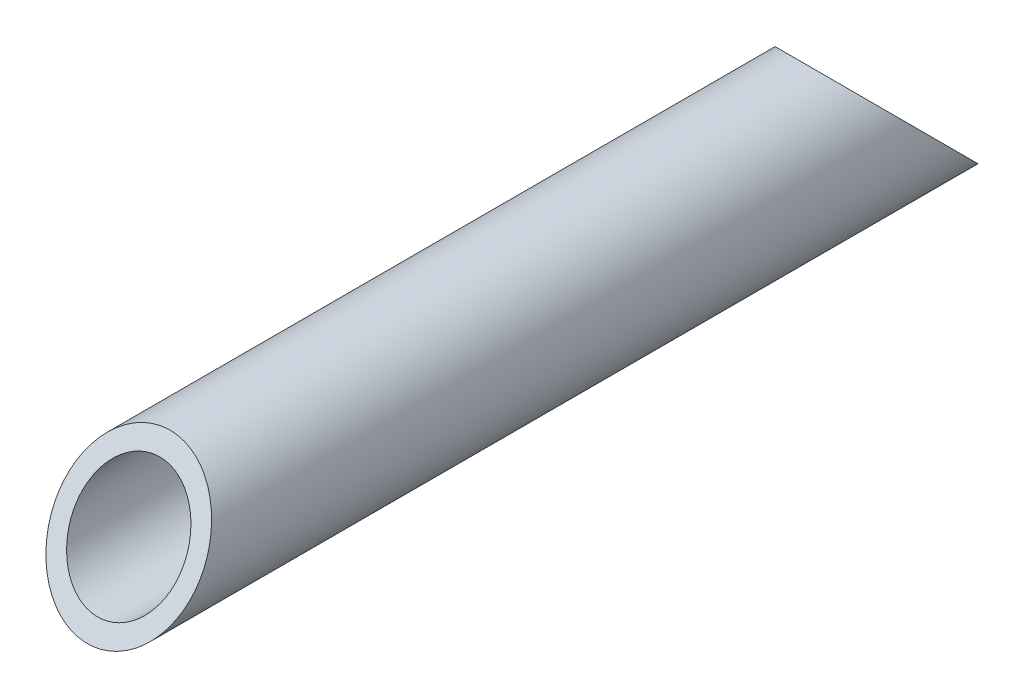
ISO-10303-21;
HEADER;
FILE_DESCRIPTION(('STEP AP214'),'2;1');
FILE_NAME('part.step','',(''),(''),'','','');
FILE_SCHEMA(('AUTOMOTIVE_DESIGN { 1 0 10303 214 1 1 1 1 }'));
ENDSEC;
DATA;
#1=APPLICATION_CONTEXT('core data for automotive mechanical design processes');
#2=APPLICATION_PROTOCOL_DEFINITION('international standard','automotive_design',2000,#1);
#3=PRODUCT_CONTEXT('',#1,'mechanical');
#4=PRODUCT('Part','Part','',(#3));
#5=PRODUCT_RELATED_PRODUCT_CATEGORY('part','',(#4));
#6=PRODUCT_DEFINITION_FORMATION('','',#4);
#7=PRODUCT_DEFINITION_CONTEXT('part definition',#1,'design');
#8=PRODUCT_DEFINITION('design','',#6,#7);
#9=PRODUCT_DEFINITION_SHAPE('','',#8);
#10=(LENGTH_UNIT() NAMED_UNIT(*) SI_UNIT(.MILLI.,.METRE.));
#11=(NAMED_UNIT(*) PLANE_ANGLE_UNIT() SI_UNIT($,.RADIAN.));
#12=(NAMED_UNIT(*) SI_UNIT($,.STERADIAN.) SOLID_ANGLE_UNIT());
#13=UNCERTAINTY_MEASURE_WITH_UNIT(LENGTH_MEASURE(1.E-05),#10,'distance_accuracy_value','');
#14=(GEOMETRIC_REPRESENTATION_CONTEXT(3) GLOBAL_UNCERTAINTY_ASSIGNED_CONTEXT((#13)) GLOBAL_UNIT_ASSIGNED_CONTEXT((#10,
#11,#12)) REPRESENTATION_CONTEXT('',''));
#15=CARTESIAN_POINT('',(0.,0.,0.));
#16=DIRECTION('',(0.,0.,1.));
#17=DIRECTION('',(1.,0.,0.));
#18=AXIS2_PLACEMENT_3D('',#15,#16,#17);
#19=CARTESIAN_POINT('',(0.,0.,76.2));
#20=DIRECTION('',(0.,0.,-1.));
#21=DIRECTION('',(-1.,0.,0.));
#22=AXIS2_PLACEMENT_3D('',#19,#20,#21);
#23=CYLINDRICAL_SURFACE('',#22,6.35);
#24=CARTESIAN_POINT('',(0.,0.,72.5338257906458));
#25=DIRECTION('',(0.,-0.500000000000004,-0.866025403784436));
#26=DIRECTION('',(0.,0.866025403784436,-0.500000000000004));
#27=AXIS2_PLACEMENT_3D('',#24,#25,#26);
#28=ELLIPSE('',#27,7.33234841870827,6.35);
#29=CARTESIAN_POINT('',(0.,6.35,68.8676515812917));
#30=VERTEX_POINT('',#29);
#31=EDGE_CURVE('E10',#30,#30,#28,.T.);
#32=ORIENTED_EDGE('',*,*,#31,.T.);
#33=EDGE_LOOP('',(#32));
#34=FACE_BOUND('',#33,.T.);
#35=CARTESIAN_POINT('',(0.,0.,6.35000000000013));
#36=DIRECTION('',(0.,-0.707106781186552,0.707106781186544));
#37=DIRECTION('',(0.,-0.707106781186544,-0.707106781186552));
#38=AXIS2_PLACEMENT_3D('',#35,#36,#37);
#39=ELLIPSE('',#38,8.9802561210692,6.35);
#40=CARTESIAN_POINT('',(0.,-6.35,0.));
#41=VERTEX_POINT('',#40);
#42=EDGE_CURVE('E42',#41,#41,#39,.T.);
#43=ORIENTED_EDGE('',*,*,#42,.T.);
#44=EDGE_LOOP('',(#43));
#45=FACE_BOUND('',#44,.T.);
#46=ADVANCED_FACE('F30',(#34,#45),#23,.T.);
#47=CARTESIAN_POINT('',(0.,0.,76.2));
#48=DIRECTION('',(0.,0.,-1.));
#49=DIRECTION('',(-1.,0.,0.));
#50=AXIS2_PLACEMENT_3D('',#47,#48,#49);
#51=CYLINDRICAL_SURFACE('',#50,4.7625);
#52=CARTESIAN_POINT('',(0.,0.,6.35000000000013));
#53=DIRECTION('',(0.,-0.707106781186552,0.707106781186544));
#54=DIRECTION('',(0.,-0.707106781186544,-0.707106781186552));
#55=AXIS2_PLACEMENT_3D('',#52,#53,#54);
#56=ELLIPSE('',#55,6.7351920908019,4.7625);
#57=CARTESIAN_POINT('',(0.,-4.7625,1.58750000000008));
#58=VERTEX_POINT('',#57);
#59=EDGE_CURVE('E33',#58,#58,#56,.T.);
#60=ORIENTED_EDGE('',*,*,#59,.F.);
#61=EDGE_LOOP('',(#60));
#62=FACE_BOUND('',#61,.T.);
#63=CARTESIAN_POINT('',(0.,0.,72.5338257906458));
#64=DIRECTION('',(0.,-0.500000000000004,-0.866025403784436));
#65=DIRECTION('',(0.,0.866025403784436,-0.500000000000004));
#66=AXIS2_PLACEMENT_3D('',#63,#64,#65);
#67=ELLIPSE('',#66,5.4992613140312,4.7625);
#68=CARTESIAN_POINT('',(0.,4.7625,69.7841951336302));
#69=VERTEX_POINT('',#68);
#70=EDGE_CURVE('E37',#69,#69,#67,.T.);
#71=ORIENTED_EDGE('',*,*,#70,.F.);
#72=EDGE_LOOP('',(#71));
#73=FACE_BOUND('',#72,.T.);
#74=ADVANCED_FACE('F53',(#62,#73),#51,.F.);
#75=CARTESIAN_POINT('',(-38.1,-6.35,76.2));
#76=DIRECTION('',(0.,-0.500000000000004,-0.866025403784436));
#77=DIRECTION('',(0.,0.866025403784436,-0.500000000000004));
#78=AXIS2_PLACEMENT_3D('',#75,#76,#77);
#79=PLANE('',#78);
#80=ORIENTED_EDGE('',*,*,#70,.T.);
#81=EDGE_LOOP('',(#80));
#82=FACE_BOUND('',#81,.T.);
#83=ORIENTED_EDGE('',*,*,#31,.F.);
#84=EDGE_LOOP('',(#83));
#85=FACE_BOUND('',#84,.T.);
#86=ADVANCED_FACE('F56',(#82,#85),#79,.F.);
#87=CARTESIAN_POINT('',(-38.1,6.35,12.7000000000002));
#88=DIRECTION('',(0.,-0.707106781186552,0.707106781186544));
#89=DIRECTION('',(0.,-0.707106781186544,-0.707106781186552));
#90=AXIS2_PLACEMENT_3D('',#87,#88,#89);
#91=PLANE('',#90);
#92=ORIENTED_EDGE('',*,*,#59,.T.);
#93=EDGE_LOOP('',(#92));
#94=FACE_BOUND('',#93,.T.);
#95=ORIENTED_EDGE('',*,*,#42,.F.);
#96=EDGE_LOOP('',(#95));
#97=FACE_BOUND('',#96,.T.);
#98=ADVANCED_FACE('F50',(#94,#97),#91,.F.);
#99=CLOSED_SHELL('',(#46,#74,#86,#98));
#100=MANIFOLD_SOLID_BREP('B2',#99);
#101=ADVANCED_BREP_SHAPE_REPRESENTATION('',(#18,#100),#14);
#102=SHAPE_DEFINITION_REPRESENTATION(#9,#101);
ENDSEC;
END-ISO-10303-21;
